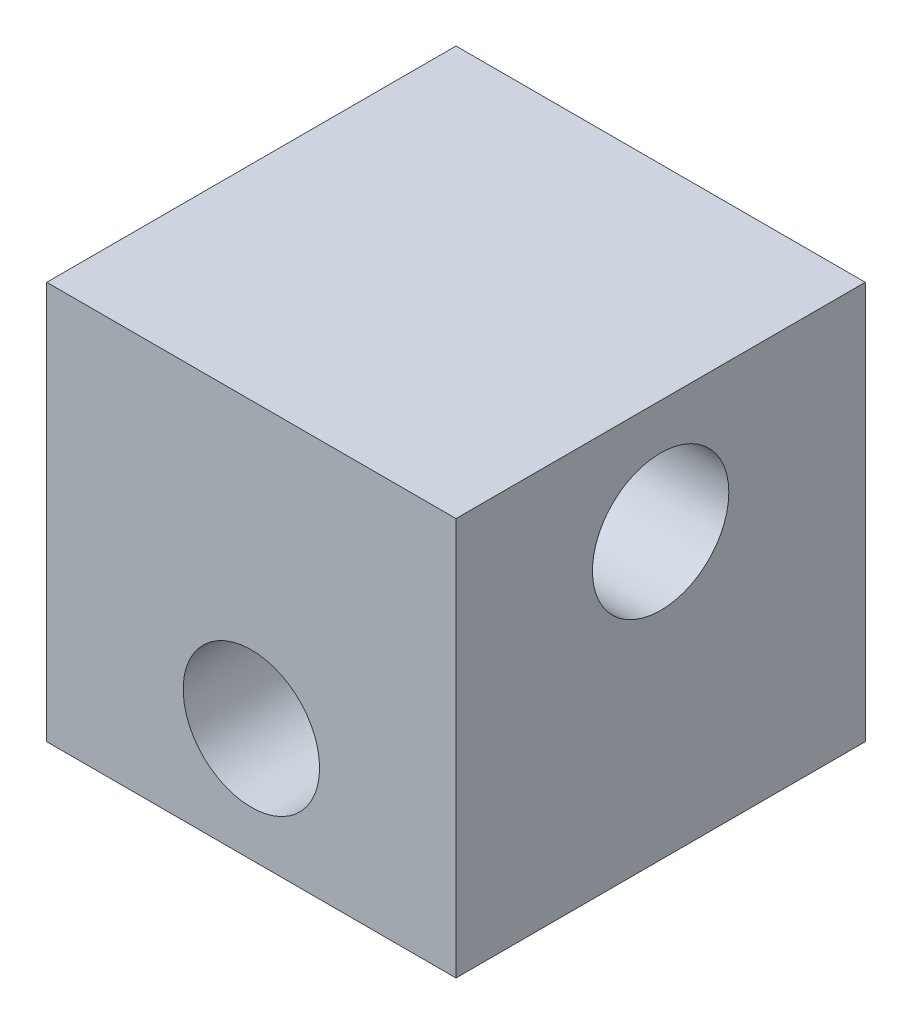
ISO-10303-21;
HEADER;
FILE_DESCRIPTION(('STEP AP214'),'2;1');
FILE_NAME('part.step','',(''),(''),'','','');
FILE_SCHEMA(('AUTOMOTIVE_DESIGN { 1 0 10303 214 1 1 1 1 }'));
ENDSEC;
DATA;
#1=APPLICATION_CONTEXT('core data for automotive mechanical design processes');
#2=APPLICATION_PROTOCOL_DEFINITION('international standard','automotive_design',2000,#1);
#3=PRODUCT_CONTEXT('',#1,'mechanical');
#4=PRODUCT('Part','Part','',(#3));
#5=PRODUCT_RELATED_PRODUCT_CATEGORY('part','',(#4));
#6=PRODUCT_DEFINITION_FORMATION('','',#4);
#7=PRODUCT_DEFINITION_CONTEXT('part definition',#1,'design');
#8=PRODUCT_DEFINITION('design','',#6,#7);
#9=PRODUCT_DEFINITION_SHAPE('','',#8);
#10=(LENGTH_UNIT() NAMED_UNIT(*) SI_UNIT(.MILLI.,.METRE.));
#11=(NAMED_UNIT(*) PLANE_ANGLE_UNIT() SI_UNIT($,.RADIAN.));
#12=(NAMED_UNIT(*) SI_UNIT($,.STERADIAN.) SOLID_ANGLE_UNIT());
#13=UNCERTAINTY_MEASURE_WITH_UNIT(LENGTH_MEASURE(1.E-05),#10,'distance_accuracy_value','');
#14=(GEOMETRIC_REPRESENTATION_CONTEXT(3) GLOBAL_UNCERTAINTY_ASSIGNED_CONTEXT((#13)) GLOBAL_UNIT_ASSIGNED_CONTEXT((#10,
#11,#12)) REPRESENTATION_CONTEXT('',''));
#15=CARTESIAN_POINT('',(0.,0.,0.));
#16=DIRECTION('',(0.,0.,1.));
#17=DIRECTION('',(1.,0.,0.));
#18=AXIS2_PLACEMENT_3D('',#15,#16,#17);
#19=CARTESIAN_POINT('',(18.,35.,-18.));
#20=DIRECTION('',(-1.,0.,0.));
#21=DIRECTION('',(0.,0.,1.));
#22=AXIS2_PLACEMENT_3D('',#19,#20,#21);
#23=PLANE('',#22);
#24=CARTESIAN_POINT('',(18.,25.,0.));
#25=DIRECTION('',(1.,0.,0.));
#26=DIRECTION('',(0.,0.,-1.));
#27=AXIS2_PLACEMENT_3D('',#24,#25,#26);
#28=CIRCLE('',#27,6.);
#29=CARTESIAN_POINT('',(18.,25.,-6.));
#30=VERTEX_POINT('',#29);
#31=EDGE_CURVE('E118',#30,#30,#28,.T.);
#32=ORIENTED_EDGE('',*,*,#31,.F.);
#33=EDGE_LOOP('',(#32));
#34=FACE_BOUND('',#33,.T.);
#35=DIRECTION('',(0.,0.,-1.));
#36=VECTOR('',#35,1.);
#37=CARTESIAN_POINT('',(18.,0.,-18.));
#38=LINE('',#37,#36);
#39=CARTESIAN_POINT('',(18.,0.,18.));
#40=VERTEX_POINT('',#39);
#41=CARTESIAN_POINT('',(18.,0.,-18.));
#42=VERTEX_POINT('',#41);
#43=EDGE_CURVE('E98',#40,#42,#38,.T.);
#44=ORIENTED_EDGE('',*,*,#43,.T.);
#45=DIRECTION('',(0.,-1.,0.));
#46=VECTOR('',#45,1.);
#47=CARTESIAN_POINT('',(18.,35.,-18.));
#48=LINE('',#47,#46);
#49=CARTESIAN_POINT('',(18.,35.,-18.));
#50=VERTEX_POINT('',#49);
#51=EDGE_CURVE('E11',#50,#42,#48,.T.);
#52=ORIENTED_EDGE('',*,*,#51,.F.);
#53=DIRECTION('',(0.,0.,-1.));
#54=VECTOR('',#53,1.);
#55=CARTESIAN_POINT('',(18.,35.,-18.));
#56=LINE('',#55,#54);
#57=CARTESIAN_POINT('',(18.,35.,18.));
#58=VERTEX_POINT('',#57);
#59=EDGE_CURVE('E86',#58,#50,#56,.T.);
#60=ORIENTED_EDGE('',*,*,#59,.F.);
#61=DIRECTION('',(0.,-1.,0.));
#62=VECTOR('',#61,1.);
#63=CARTESIAN_POINT('',(18.,35.,18.));
#64=LINE('',#63,#62);
#65=EDGE_CURVE('E94',#58,#40,#64,.T.);
#66=ORIENTED_EDGE('',*,*,#65,.T.);
#67=EDGE_LOOP('',(#44,#52,#60,#66));
#68=FACE_BOUND('',#67,.T.);
#69=ADVANCED_FACE('F35',(#34,#68),#23,.F.);
#70=CARTESIAN_POINT('',(-18.,35.,-18.));
#71=DIRECTION('',(0.,0.,1.));
#72=DIRECTION('',(1.,0.,0.));
#73=AXIS2_PLACEMENT_3D('',#70,#71,#72);
#74=PLANE('',#73);
#75=CARTESIAN_POINT('',(0.,10.,-18.));
#76=DIRECTION('',(0.,0.,1.));
#77=DIRECTION('',(1.,0.,0.));
#78=AXIS2_PLACEMENT_3D('',#75,#76,#77);
#79=CIRCLE('',#78,6.);
#80=CARTESIAN_POINT('',(6.,10.,-18.));
#81=VERTEX_POINT('',#80);
#82=EDGE_CURVE('E101',#81,#81,#79,.T.);
#83=ORIENTED_EDGE('',*,*,#82,.T.);
#84=EDGE_LOOP('',(#83));
#85=FACE_BOUND('',#84,.T.);
#86=DIRECTION('',(-1.,0.,0.));
#87=VECTOR('',#86,1.);
#88=CARTESIAN_POINT('',(-18.,0.,-18.));
#89=LINE('',#88,#87);
#90=CARTESIAN_POINT('',(-18.,0.,-18.));
#91=VERTEX_POINT('',#90);
#92=EDGE_CURVE('E90',#42,#91,#89,.T.);
#93=ORIENTED_EDGE('',*,*,#92,.T.);
#94=DIRECTION('',(0.,-1.,0.));
#95=VECTOR('',#94,1.);
#96=CARTESIAN_POINT('',(-18.,35.,-18.));
#97=LINE('',#96,#95);
#98=CARTESIAN_POINT('',(-18.,35.,-18.));
#99=VERTEX_POINT('',#98);
#100=EDGE_CURVE('E43',#99,#91,#97,.T.);
#101=ORIENTED_EDGE('',*,*,#100,.F.);
#102=DIRECTION('',(-1.,0.,0.));
#103=VECTOR('',#102,1.);
#104=CARTESIAN_POINT('',(-18.,35.,-18.));
#105=LINE('',#104,#103);
#106=EDGE_CURVE('E81',#50,#99,#105,.T.);
#107=ORIENTED_EDGE('',*,*,#106,.F.);
#108=ORIENTED_EDGE('',*,*,#51,.T.);
#109=EDGE_LOOP('',(#93,#101,#107,#108));
#110=FACE_BOUND('',#109,.T.);
#111=ADVANCED_FACE('F89',(#85,#110),#74,.F.);
#112=CARTESIAN_POINT('',(-18.,35.,-18.));
#113=DIRECTION('',(1.,0.,0.));
#114=DIRECTION('',(0.,0.,-1.));
#115=AXIS2_PLACEMENT_3D('',#112,#113,#114);
#116=PLANE('',#115);
#117=CARTESIAN_POINT('',(-18.,25.,0.));
#118=DIRECTION('',(1.,0.,0.));
#119=DIRECTION('',(0.,0.,-1.));
#120=AXIS2_PLACEMENT_3D('',#117,#118,#119);
#121=CIRCLE('',#120,6.);
#122=CARTESIAN_POINT('',(-18.,25.,-6.));
#123=VERTEX_POINT('',#122);
#124=EDGE_CURVE('E115',#123,#123,#121,.T.);
#125=ORIENTED_EDGE('',*,*,#124,.T.);
#126=EDGE_LOOP('',(#125));
#127=FACE_BOUND('',#126,.T.);
#128=DIRECTION('',(0.,0.,1.));
#129=VECTOR('',#128,1.);
#130=CARTESIAN_POINT('',(-18.,0.,-18.));
#131=LINE('',#130,#129);
#132=CARTESIAN_POINT('',(-18.,0.,18.));
#133=VERTEX_POINT('',#132);
#134=EDGE_CURVE('E68',#91,#133,#131,.T.);
#135=ORIENTED_EDGE('',*,*,#134,.T.);
#136=DIRECTION('',(0.,-1.,0.));
#137=VECTOR('',#136,1.);
#138=CARTESIAN_POINT('',(-18.,35.,18.));
#139=LINE('',#138,#137);
#140=CARTESIAN_POINT('',(-18.,35.,18.));
#141=VERTEX_POINT('',#140);
#142=EDGE_CURVE('E91',#141,#133,#139,.T.);
#143=ORIENTED_EDGE('',*,*,#142,.F.);
#144=DIRECTION('',(0.,0.,1.));
#145=VECTOR('',#144,1.);
#146=CARTESIAN_POINT('',(-18.,35.,-18.));
#147=LINE('',#146,#145);
#148=EDGE_CURVE('E84',#99,#141,#147,.T.);
#149=ORIENTED_EDGE('',*,*,#148,.F.);
#150=ORIENTED_EDGE('',*,*,#100,.T.);
#151=EDGE_LOOP('',(#135,#143,#149,#150));
#152=FACE_BOUND('',#151,.T.);
#153=ADVANCED_FACE('F92',(#127,#152),#116,.F.);
#154=CARTESIAN_POINT('',(-18.,35.,18.));
#155=DIRECTION('',(0.,0.,-1.));
#156=DIRECTION('',(-1.,0.,0.));
#157=AXIS2_PLACEMENT_3D('',#154,#155,#156);
#158=PLANE('',#157);
#159=CARTESIAN_POINT('',(0.,10.,18.));
#160=DIRECTION('',(0.,0.,1.));
#161=DIRECTION('',(1.,0.,0.));
#162=AXIS2_PLACEMENT_3D('',#159,#160,#161);
#163=CIRCLE('',#162,6.);
#164=CARTESIAN_POINT('',(6.,10.,18.));
#165=VERTEX_POINT('',#164);
#166=EDGE_CURVE('E112',#165,#165,#163,.T.);
#167=ORIENTED_EDGE('',*,*,#166,.F.);
#168=EDGE_LOOP('',(#167));
#169=FACE_BOUND('',#168,.T.);
#170=DIRECTION('',(1.,0.,0.));
#171=VECTOR('',#170,1.);
#172=CARTESIAN_POINT('',(-18.,0.,18.));
#173=LINE('',#172,#171);
#174=EDGE_CURVE('E74',#133,#40,#173,.T.);
#175=ORIENTED_EDGE('',*,*,#174,.T.);
#176=ORIENTED_EDGE('',*,*,#65,.F.);
#177=DIRECTION('',(1.,0.,0.));
#178=VECTOR('',#177,1.);
#179=CARTESIAN_POINT('',(-18.,35.,18.));
#180=LINE('',#179,#178);
#181=EDGE_CURVE('E51',#141,#58,#180,.T.);
#182=ORIENTED_EDGE('',*,*,#181,.F.);
#183=ORIENTED_EDGE('',*,*,#142,.T.);
#184=EDGE_LOOP('',(#175,#176,#182,#183));
#185=FACE_BOUND('',#184,.T.);
#186=ADVANCED_FACE('F106',(#169,#185),#158,.F.);
#187=CARTESIAN_POINT('',(0.,35.,0.));
#188=DIRECTION('',(0.,1.,0.));
#189=DIRECTION('',(0.,0.,1.));
#190=AXIS2_PLACEMENT_3D('',#187,#188,#189);
#191=PLANE('',#190);
#192=ORIENTED_EDGE('',*,*,#59,.T.);
#193=ORIENTED_EDGE('',*,*,#106,.T.);
#194=ORIENTED_EDGE('',*,*,#148,.T.);
#195=ORIENTED_EDGE('',*,*,#181,.T.);
#196=EDGE_LOOP('',(#192,#193,#194,#195));
#197=FACE_BOUND('',#196,.T.);
#198=ADVANCED_FACE('F82',(#197),#191,.T.);
#199=CARTESIAN_POINT('',(0.,0.,0.));
#200=DIRECTION('',(0.,1.,0.));
#201=DIRECTION('',(0.,0.,1.));
#202=AXIS2_PLACEMENT_3D('',#199,#200,#201);
#203=PLANE('',#202);
#204=ORIENTED_EDGE('',*,*,#43,.F.);
#205=ORIENTED_EDGE('',*,*,#174,.F.);
#206=ORIENTED_EDGE('',*,*,#134,.F.);
#207=ORIENTED_EDGE('',*,*,#92,.F.);
#208=EDGE_LOOP('',(#204,#205,#206,#207));
#209=FACE_BOUND('',#208,.T.);
#210=ADVANCED_FACE('F109',(#209),#203,.F.);
#211=CARTESIAN_POINT('',(0.,10.,-18.));
#212=DIRECTION('',(0.,0.,1.));
#213=DIRECTION('',(1.,0.,0.));
#214=AXIS2_PLACEMENT_3D('',#211,#212,#213);
#215=CYLINDRICAL_SURFACE('',#214,6.);
#216=ORIENTED_EDGE('',*,*,#82,.F.);
#217=EDGE_LOOP('',(#216));
#218=FACE_BOUND('',#217,.T.);
#219=ORIENTED_EDGE('',*,*,#166,.T.);
#220=EDGE_LOOP('',(#219));
#221=FACE_BOUND('',#220,.T.);
#222=ADVANCED_FACE('F128',(#218,#221),#215,.F.);
#223=CARTESIAN_POINT('',(-18.,25.,0.));
#224=DIRECTION('',(1.,0.,0.));
#225=DIRECTION('',(0.,0.,-1.));
#226=AXIS2_PLACEMENT_3D('',#223,#224,#225);
#227=CYLINDRICAL_SURFACE('',#226,6.);
#228=ORIENTED_EDGE('',*,*,#124,.F.);
#229=EDGE_LOOP('',(#228));
#230=FACE_BOUND('',#229,.T.);
#231=ORIENTED_EDGE('',*,*,#31,.T.);
#232=EDGE_LOOP('',(#231));
#233=FACE_BOUND('',#232,.T.);
#234=ADVANCED_FACE('F125',(#230,#233),#227,.F.);
#235=CLOSED_SHELL('',(#69,#111,#153,#186,#198,#210,#222,#234));
#236=MANIFOLD_SOLID_BREP('B2',#235);
#237=ADVANCED_BREP_SHAPE_REPRESENTATION('',(#18,#236),#14);
#238=SHAPE_DEFINITION_REPRESENTATION(#9,#237);
ENDSEC;
END-ISO-10303-21;
